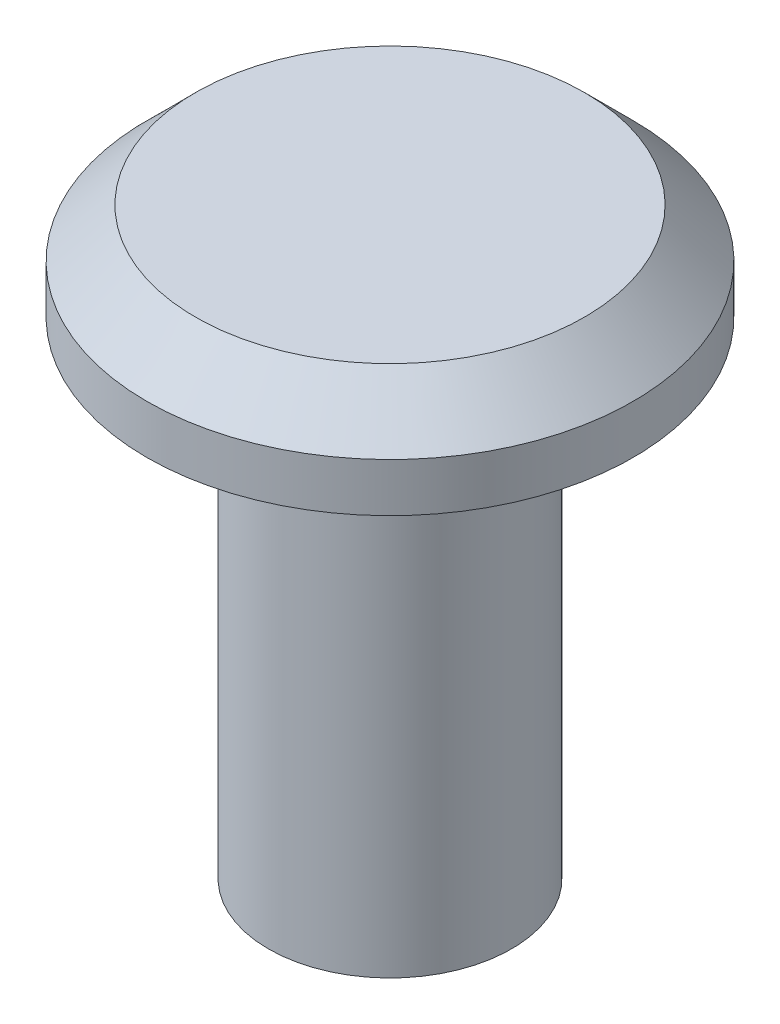
ISO-10303-21;
HEADER;
FILE_DESCRIPTION(('STEP AP214'),'2;1');
FILE_NAME('part.step','',(''),(''),'','','');
FILE_SCHEMA(('AUTOMOTIVE_DESIGN { 1 0 10303 214 1 1 1 1 }'));
ENDSEC;
DATA;
#1=APPLICATION_CONTEXT('core data for automotive mechanical design processes');
#2=APPLICATION_PROTOCOL_DEFINITION('international standard','automotive_design',2000,#1);
#3=PRODUCT_CONTEXT('',#1,'mechanical');
#4=PRODUCT('Part','Part','',(#3));
#5=PRODUCT_RELATED_PRODUCT_CATEGORY('part','',(#4));
#6=PRODUCT_DEFINITION_FORMATION('','',#4);
#7=PRODUCT_DEFINITION_CONTEXT('part definition',#1,'design');
#8=PRODUCT_DEFINITION('design','',#6,#7);
#9=PRODUCT_DEFINITION_SHAPE('','',#8);
#10=(LENGTH_UNIT() NAMED_UNIT(*) SI_UNIT(.MILLI.,.METRE.));
#11=(NAMED_UNIT(*) PLANE_ANGLE_UNIT() SI_UNIT($,.RADIAN.));
#12=(NAMED_UNIT(*) SI_UNIT($,.STERADIAN.) SOLID_ANGLE_UNIT());
#13=UNCERTAINTY_MEASURE_WITH_UNIT(LENGTH_MEASURE(1.E-05),#10,'distance_accuracy_value','');
#14=(GEOMETRIC_REPRESENTATION_CONTEXT(3) GLOBAL_UNCERTAINTY_ASSIGNED_CONTEXT((#13)) GLOBAL_UNIT_ASSIGNED_CONTEXT((#10,
#11,#12)) REPRESENTATION_CONTEXT('',''));
#15=CARTESIAN_POINT('',(0.,0.,0.));
#16=DIRECTION('',(0.,0.,1.));
#17=DIRECTION('',(1.,0.,0.));
#18=AXIS2_PLACEMENT_3D('',#15,#16,#17);
#19=CARTESIAN_POINT('',(-2.5,0.,0.));
#20=DIRECTION('',(0.,1.,0.));
#21=DIRECTION('',(0.,0.,1.));
#22=AXIS2_PLACEMENT_3D('',#19,#20,#21);
#23=PLANE('',#22);
#24=CARTESIAN_POINT('',(0.,0.,0.));
#25=DIRECTION('',(0.,-1.,0.));
#26=DIRECTION('',(0.,0.,-1.));
#27=AXIS2_PLACEMENT_3D('',#24,#25,#26);
#28=CIRCLE('',#27,2.5);
#29=CARTESIAN_POINT('',(0.,0.,-2.5));
#30=VERTEX_POINT('',#29);
#31=EDGE_CURVE('E60',#30,#30,#28,.T.);
#32=ORIENTED_EDGE('',*,*,#31,.T.);
#33=EDGE_LOOP('',(#32));
#34=FACE_BOUND('',#33,.T.);
#35=ADVANCED_FACE('F37',(#34),#23,.F.);
#36=CARTESIAN_POINT('',(0.,12.,0.));
#37=DIRECTION('',(0.,-1.,0.));
#38=DIRECTION('',(0.,0.,-1.));
#39=AXIS2_PLACEMENT_3D('',#36,#37,#38);
#40=PLANE('',#39);
#41=CARTESIAN_POINT('',(0.,12.,0.));
#42=DIRECTION('',(0.,-1.,0.));
#43=DIRECTION('',(0.,0.,-1.));
#44=AXIS2_PLACEMENT_3D('',#41,#42,#43);
#45=CIRCLE('',#44,4.);
#46=CARTESIAN_POINT('',(0.,12.,-4.));
#47=VERTEX_POINT('',#46);
#48=EDGE_CURVE('E10',#47,#47,#45,.T.);
#49=ORIENTED_EDGE('',*,*,#48,.F.);
#50=EDGE_LOOP('',(#49));
#51=FACE_BOUND('',#50,.T.);
#52=ADVANCED_FACE('F85',(#51),#40,.F.);
#53=CARTESIAN_POINT('',(0.,12.,0.));
#54=DIRECTION('',(0.,-1.,0.));
#55=DIRECTION('',(0.,0.,-1.));
#56=AXIS2_PLACEMENT_3D('',#53,#54,#55);
#57=CONICAL_SURFACE('',#56,4.,0.78539816339745);
#58=CARTESIAN_POINT('',(0.,11.,0.));
#59=DIRECTION('',(0.,-1.,0.));
#60=DIRECTION('',(0.,0.,-1.));
#61=AXIS2_PLACEMENT_3D('',#58,#59,#60);
#62=CIRCLE('',#61,5.);
#63=CARTESIAN_POINT('',(0.,11.,-5.));
#64=VERTEX_POINT('',#63);
#65=EDGE_CURVE('E44',#64,#64,#62,.T.);
#66=ORIENTED_EDGE('',*,*,#65,.F.);
#67=EDGE_LOOP('',(#66));
#68=FACE_BOUND('',#67,.T.);
#69=ORIENTED_EDGE('',*,*,#48,.T.);
#70=EDGE_LOOP('',(#69));
#71=FACE_BOUND('',#70,.T.);
#72=ADVANCED_FACE('F80',(#68,#71),#57,.T.);
#73=CARTESIAN_POINT('',(0.,0.,0.));
#74=DIRECTION('',(0.,-1.,0.));
#75=DIRECTION('',(0.,0.,-1.));
#76=AXIS2_PLACEMENT_3D('',#73,#74,#75);
#77=CYLINDRICAL_SURFACE('',#76,5.);
#78=CARTESIAN_POINT('',(0.,10.,0.));
#79=DIRECTION('',(0.,-1.,0.));
#80=DIRECTION('',(0.,0.,-1.));
#81=AXIS2_PLACEMENT_3D('',#78,#79,#80);
#82=CIRCLE('',#81,5.);
#83=CARTESIAN_POINT('',(0.,10.,-5.));
#84=VERTEX_POINT('',#83);
#85=EDGE_CURVE('E49',#84,#84,#82,.T.);
#86=ORIENTED_EDGE('',*,*,#85,.F.);
#87=EDGE_LOOP('',(#86));
#88=FACE_BOUND('',#87,.T.);
#89=ORIENTED_EDGE('',*,*,#65,.T.);
#90=EDGE_LOOP('',(#89));
#91=FACE_BOUND('',#90,.T.);
#92=ADVANCED_FACE('F75',(#88,#91),#77,.T.);
#93=CARTESIAN_POINT('',(-5.,10.,0.));
#94=DIRECTION('',(0.,1.,0.));
#95=DIRECTION('',(0.,0.,1.));
#96=AXIS2_PLACEMENT_3D('',#93,#94,#95);
#97=PLANE('',#96);
#98=CARTESIAN_POINT('',(0.,10.,0.));
#99=DIRECTION('',(0.,-1.,0.));
#100=DIRECTION('',(0.,0.,-1.));
#101=AXIS2_PLACEMENT_3D('',#98,#99,#100);
#102=CIRCLE('',#101,2.5);
#103=CARTESIAN_POINT('',(0.,10.,-2.5));
#104=VERTEX_POINT('',#103);
#105=EDGE_CURVE('E54',#104,#104,#102,.T.);
#106=ORIENTED_EDGE('',*,*,#105,.F.);
#107=EDGE_LOOP('',(#106));
#108=FACE_BOUND('',#107,.T.);
#109=ORIENTED_EDGE('',*,*,#85,.T.);
#110=EDGE_LOOP('',(#109));
#111=FACE_BOUND('',#110,.T.);
#112=ADVANCED_FACE('F69',(#108,#111),#97,.F.);
#113=CARTESIAN_POINT('',(0.,0.,0.));
#114=DIRECTION('',(0.,-1.,0.));
#115=DIRECTION('',(0.,0.,-1.));
#116=AXIS2_PLACEMENT_3D('',#113,#114,#115);
#117=CYLINDRICAL_SURFACE('',#116,2.5);
#118=ORIENTED_EDGE('',*,*,#31,.F.);
#119=EDGE_LOOP('',(#118));
#120=FACE_BOUND('',#119,.T.);
#121=ORIENTED_EDGE('',*,*,#105,.T.);
#122=EDGE_LOOP('',(#121));
#123=FACE_BOUND('',#122,.T.);
#124=ADVANCED_FACE('F66',(#120,#123),#117,.T.);
#125=CLOSED_SHELL('',(#35,#52,#72,#92,#112,#124));
#126=MANIFOLD_SOLID_BREP('B2',#125);
#127=ADVANCED_BREP_SHAPE_REPRESENTATION('',(#18,#126),#14);
#128=SHAPE_DEFINITION_REPRESENTATION(#9,#127);
ENDSEC;
END-ISO-10303-21;
